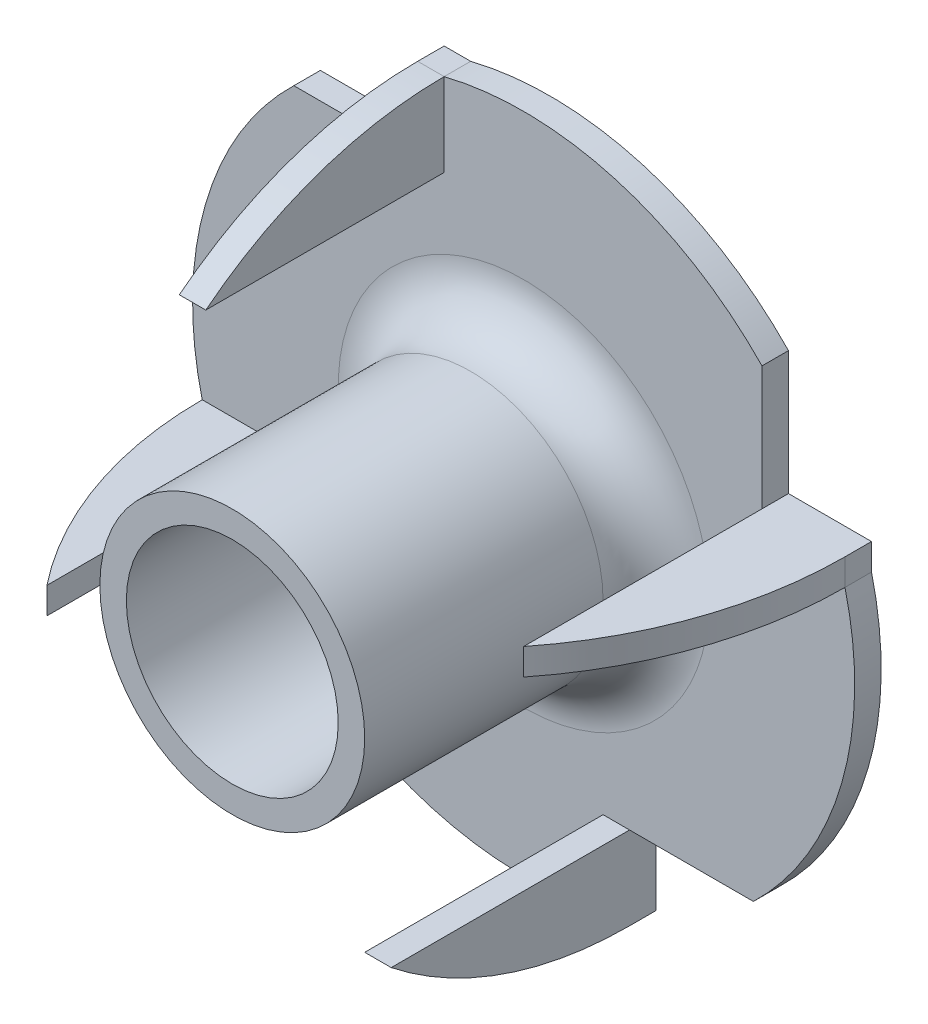
ISO-10303-21;
HEADER;
FILE_DESCRIPTION(('STEP AP214'),'2;1');
FILE_NAME('part.step','',(''),(''),'','','');
FILE_SCHEMA(('AUTOMOTIVE_DESIGN { 1 0 10303 214 1 1 1 1 }'));
ENDSEC;
DATA;
#1=APPLICATION_CONTEXT('core data for automotive mechanical design processes');
#2=APPLICATION_PROTOCOL_DEFINITION('international standard','automotive_design',2000,#1);
#3=PRODUCT_CONTEXT('',#1,'mechanical');
#4=PRODUCT('Part','Part','',(#3));
#5=PRODUCT_RELATED_PRODUCT_CATEGORY('part','',(#4));
#6=PRODUCT_DEFINITION_FORMATION('','',#4);
#7=PRODUCT_DEFINITION_CONTEXT('part definition',#1,'design');
#8=PRODUCT_DEFINITION('design','',#6,#7);
#9=PRODUCT_DEFINITION_SHAPE('','',#8);
#10=(LENGTH_UNIT() NAMED_UNIT(*) SI_UNIT(.MILLI.,.METRE.));
#11=(NAMED_UNIT(*) PLANE_ANGLE_UNIT() SI_UNIT($,.RADIAN.));
#12=(NAMED_UNIT(*) SI_UNIT($,.STERADIAN.) SOLID_ANGLE_UNIT());
#13=UNCERTAINTY_MEASURE_WITH_UNIT(LENGTH_MEASURE(1.E-05),#10,'distance_accuracy_value','');
#14=(GEOMETRIC_REPRESENTATION_CONTEXT(3) GLOBAL_UNCERTAINTY_ASSIGNED_CONTEXT((#13)) GLOBAL_UNIT_ASSIGNED_CONTEXT((#10,
#11,#12)) REPRESENTATION_CONTEXT('',''));
#15=CARTESIAN_POINT('',(0.,0.,0.));
#16=DIRECTION('',(0.,0.,1.));
#17=DIRECTION('',(1.,0.,0.));
#18=AXIS2_PLACEMENT_3D('',#15,#16,#17);
#19=CARTESIAN_POINT('',(8.67467578644865,-9.00000000000009,-1.001));
#20=DIRECTION('',(0.,1.,0.));
#21=DIRECTION('',(-1.,0.,0.));
#22=AXIS2_PLACEMENT_3D('',#19,#20,#21);
#23=PLANE('',#22);
#24=DIRECTION('',(0.,0.,1.));
#25=VECTOR('',#24,1.);
#26=CARTESIAN_POINT('',(3.99999999999991,-9.00000000000004,-1.));
#27=LINE('',#26,#25);
#28=CARTESIAN_POINT('',(3.99999999999989,-9.00000000000004,-1.));
#29=VERTEX_POINT('',#28);
#30=CARTESIAN_POINT('',(3.99999999999989,-9.00000000000004,0.));
#31=VERTEX_POINT('',#30);
#32=EDGE_CURVE('E75',#29,#31,#27,.T.);
#33=ORIENTED_EDGE('',*,*,#32,.F.);
#34=DIRECTION('',(1.,0.,0.));
#35=VECTOR('',#34,1.);
#36=CARTESIAN_POINT('',(8.67467578644865,-9.00000000000009,-1.));
#37=LINE('',#36,#35);
#38=CARTESIAN_POINT('',(8.67467578644865,-9.00000000000009,-1.));
#39=VERTEX_POINT('',#38);
#40=EDGE_CURVE('E339',#29,#39,#37,.T.);
#41=ORIENTED_EDGE('',*,*,#40,.T.);
#42=DIRECTION('',(0.,0.,1.));
#43=VECTOR('',#42,1.);
#44=CARTESIAN_POINT('',(8.67467578644865,-9.00000000000009,14.9921573509274));
#45=LINE('',#44,#43);
#46=CARTESIAN_POINT('',(8.67467578644865,-9.00000000000009,0.));
#47=VERTEX_POINT('',#46);
#48=EDGE_CURVE('E218',#47,#39,#45,.F.);
#49=ORIENTED_EDGE('',*,*,#48,.F.);
#50=DIRECTION('',(-1.,0.,0.));
#51=VECTOR('',#50,1.);
#52=CARTESIAN_POINT('',(8.67467578644865,-9.00000000000009,0.));
#53=LINE('',#52,#51);
#54=EDGE_CURVE('E359',#47,#31,#53,.T.);
#55=ORIENTED_EDGE('',*,*,#54,.T.);
#56=EDGE_LOOP('',(#33,#41,#49,#55));
#57=FACE_BOUND('',#56,.T.);
#58=ADVANCED_FACE('F50',(#57),#23,.F.);
#59=CARTESIAN_POINT('',(9.,8.67467578644874,-1.001));
#60=DIRECTION('',(-1.,0.,0.));
#61=DIRECTION('',(0.,-1.,0.));
#62=AXIS2_PLACEMENT_3D('',#59,#60,#61);
#63=PLANE('',#62);
#64=DIRECTION('',(0.,0.,1.));
#65=VECTOR('',#64,1.);
#66=CARTESIAN_POINT('',(9.,4.,-1.));
#67=LINE('',#66,#65);
#68=CARTESIAN_POINT('',(9.,4.,-1.));
#69=VERTEX_POINT('',#68);
#70=CARTESIAN_POINT('',(9.,4.,0.));
#71=VERTEX_POINT('',#70);
#72=EDGE_CURVE('E253',#69,#71,#67,.T.);
#73=ORIENTED_EDGE('',*,*,#72,.F.);
#74=DIRECTION('',(0.,1.,0.));
#75=VECTOR('',#74,1.);
#76=CARTESIAN_POINT('',(9.,8.67467578644874,-1.));
#77=LINE('',#76,#75);
#78=CARTESIAN_POINT('',(9.,8.67467578644874,-1.));
#79=VERTEX_POINT('',#78);
#80=EDGE_CURVE('E312',#69,#79,#77,.T.);
#81=ORIENTED_EDGE('',*,*,#80,.T.);
#82=DIRECTION('',(0.,0.,1.));
#83=VECTOR('',#82,1.);
#84=CARTESIAN_POINT('',(9.,8.67467578644874,14.9921573509274));
#85=LINE('',#84,#83);
#86=CARTESIAN_POINT('',(9.,8.67467578644874,0.));
#87=VERTEX_POINT('',#86);
#88=EDGE_CURVE('E332',#87,#79,#85,.F.);
#89=ORIENTED_EDGE('',*,*,#88,.F.);
#90=DIRECTION('',(0.,-1.,0.));
#91=VECTOR('',#90,1.);
#92=CARTESIAN_POINT('',(9.,8.67467578644874,0.));
#93=LINE('',#92,#91);
#94=EDGE_CURVE('E342',#87,#71,#93,.T.);
#95=ORIENTED_EDGE('',*,*,#94,.T.);
#96=EDGE_LOOP('',(#73,#81,#89,#95));
#97=FACE_BOUND('',#96,.T.);
#98=ADVANCED_FACE('F555',(#97),#63,.F.);
#99=CARTESIAN_POINT('',(-8.67467578644871,9.00000000000003,-1.001));
#100=DIRECTION('',(0.,-1.,0.));
#101=DIRECTION('',(1.,0.,0.));
#102=AXIS2_PLACEMENT_3D('',#99,#100,#101);
#103=PLANE('',#102);
#104=DIRECTION('',(0.,0.,1.));
#105=VECTOR('',#104,1.);
#106=CARTESIAN_POINT('',(-3.99999999999997,9.00000000000001,-1.));
#107=LINE('',#106,#105);
#108=CARTESIAN_POINT('',(-3.99999999999996,9.00000000000001,-1.));
#109=VERTEX_POINT('',#108);
#110=CARTESIAN_POINT('',(-3.99999999999996,9.00000000000001,0.));
#111=VERTEX_POINT('',#110);
#112=EDGE_CURVE('E63',#109,#111,#107,.T.);
#113=ORIENTED_EDGE('',*,*,#112,.F.);
#114=DIRECTION('',(-1.,0.,0.));
#115=VECTOR('',#114,1.);
#116=CARTESIAN_POINT('',(-8.67467578644871,9.00000000000003,-1.));
#117=LINE('',#116,#115);
#118=CARTESIAN_POINT('',(-8.67467578644871,9.00000000000003,-1.));
#119=VERTEX_POINT('',#118);
#120=EDGE_CURVE('E330',#109,#119,#117,.T.);
#121=ORIENTED_EDGE('',*,*,#120,.T.);
#122=DIRECTION('',(0.,0.,1.));
#123=VECTOR('',#122,1.);
#124=CARTESIAN_POINT('',(-8.67467578644871,9.00000000000003,14.9921573509274));
#125=LINE('',#124,#123);
#126=CARTESIAN_POINT('',(-8.67467578644871,9.00000000000003,0.));
#127=VERTEX_POINT('',#126);
#128=EDGE_CURVE('E309',#127,#119,#125,.F.);
#129=ORIENTED_EDGE('',*,*,#128,.F.);
#130=DIRECTION('',(1.,0.,0.));
#131=VECTOR('',#130,1.);
#132=CARTESIAN_POINT('',(-8.67467578644871,9.00000000000003,0.));
#133=LINE('',#132,#131);
#134=EDGE_CURVE('E319',#127,#111,#133,.T.);
#135=ORIENTED_EDGE('',*,*,#134,.T.);
#136=EDGE_LOOP('',(#113,#121,#129,#135));
#137=FACE_BOUND('',#136,.T.);
#138=ADVANCED_FACE('F560',(#137),#103,.F.);
#139=CARTESIAN_POINT('',(0.,7.,-1.));
#140=DIRECTION('',(0.,0.,1.));
#141=DIRECTION('',(1.,0.,0.));
#142=AXIS2_PLACEMENT_3D('',#139,#140,#141);
#143=PLANE('',#142);
#144=ORIENTED_EDGE('',*,*,#80,.F.);
#145=DIRECTION('',(-1.,0.,0.));
#146=VECTOR('',#145,1.);
#147=CARTESIAN_POINT('',(9.,4.,-1.));
#148=LINE('',#147,#146);
#149=CARTESIAN_POINT('',(12.1346610995116,4.,-1.));
#150=VERTEX_POINT('',#149);
#151=EDGE_CURVE('E242',#150,#69,#148,.T.);
#152=ORIENTED_EDGE('',*,*,#151,.F.);
#153=DIRECTION('',(0.,-1.,0.));
#154=VECTOR('',#153,1.);
#155=CARTESIAN_POINT('',(12.1346610995116,4.,-1.));
#156=LINE('',#155,#154);
#157=CARTESIAN_POINT('',(12.1346610995116,3.,-1.));
#158=VERTEX_POINT('',#157);
#159=EDGE_CURVE('E261',#150,#158,#156,.T.);
#160=ORIENTED_EDGE('',*,*,#159,.T.);
#161=CARTESIAN_POINT('',(0.,0.,-1.));
#162=DIRECTION('',(0.,0.,1.));
#163=DIRECTION('',(1.,0.,0.));
#164=AXIS2_PLACEMENT_3D('',#161,#162,#163);
#165=CIRCLE('',#164,12.5);
#166=EDGE_CURVE('E57',#39,#158,#165,.T.);
#167=ORIENTED_EDGE('',*,*,#166,.F.);
#168=ORIENTED_EDGE('',*,*,#40,.F.);
#169=DIRECTION('',(0.,1.,0.));
#170=VECTOR('',#169,1.);
#171=CARTESIAN_POINT('',(3.99999999999991,-9.00000000000004,-1.));
#172=LINE('',#171,#170);
#173=CARTESIAN_POINT('',(3.99999999999987,-12.1346610995116,-1.));
#174=VERTEX_POINT('',#173);
#175=EDGE_CURVE('E276',#174,#29,#172,.T.);
#176=ORIENTED_EDGE('',*,*,#175,.F.);
#177=DIRECTION('',(-1.,0.,0.));
#178=VECTOR('',#177,1.);
#179=CARTESIAN_POINT('',(3.99999999999987,-12.1346610995116,-1.));
#180=LINE('',#179,#178);
#181=CARTESIAN_POINT('',(2.99999999999987,-12.1346610995116,-1.));
#182=VERTEX_POINT('',#181);
#183=EDGE_CURVE('E291',#174,#182,#180,.T.);
#184=ORIENTED_EDGE('',*,*,#183,.T.);
#185=CARTESIAN_POINT('',(-9.,-8.67467578644874,-1.));
#186=VERTEX_POINT('',#185);
#187=EDGE_CURVE('E11',#186,#182,#165,.T.);
#188=ORIENTED_EDGE('',*,*,#187,.F.);
#189=DIRECTION('',(0.,-1.,0.));
#190=VECTOR('',#189,1.);
#191=CARTESIAN_POINT('',(-9.,-8.67467578644874,-1.));
#192=LINE('',#191,#190);
#193=CARTESIAN_POINT('',(-9.,-4.,-1.));
#194=VERTEX_POINT('',#193);
#195=EDGE_CURVE('E416',#194,#186,#192,.T.);
#196=ORIENTED_EDGE('',*,*,#195,.F.);
#197=DIRECTION('',(1.,0.,0.));
#198=VECTOR('',#197,1.);
#199=CARTESIAN_POINT('',(-9.,-4.,-1.));
#200=LINE('',#199,#198);
#201=CARTESIAN_POINT('',(-12.1346610995116,-4.,-1.));
#202=VERTEX_POINT('',#201);
#203=EDGE_CURVE('E366',#202,#194,#200,.T.);
#204=ORIENTED_EDGE('',*,*,#203,.F.);
#205=DIRECTION('',(0.,1.,0.));
#206=VECTOR('',#205,1.);
#207=CARTESIAN_POINT('',(-12.1346610995116,-4.,-1.));
#208=LINE('',#207,#206);
#209=CARTESIAN_POINT('',(-12.1346610995116,-3.,-1.));
#210=VERTEX_POINT('',#209);
#211=EDGE_CURVE('E383',#202,#210,#208,.T.);
#212=ORIENTED_EDGE('',*,*,#211,.T.);
#213=EDGE_CURVE('E60',#119,#210,#165,.T.);
#214=ORIENTED_EDGE('',*,*,#213,.F.);
#215=ORIENTED_EDGE('',*,*,#120,.F.);
#216=DIRECTION('',(0.,-1.,0.));
#217=VECTOR('',#216,1.);
#218=CARTESIAN_POINT('',(-3.99999999999997,9.00000000000001,-1.));
#219=LINE('',#218,#217);
#220=CARTESIAN_POINT('',(-3.99999999999996,12.1346610995116,-1.));
#221=VERTEX_POINT('',#220);
#222=EDGE_CURVE('E208',#221,#109,#219,.T.);
#223=ORIENTED_EDGE('',*,*,#222,.F.);
#224=DIRECTION('',(1.,0.,0.));
#225=VECTOR('',#224,1.);
#226=CARTESIAN_POINT('',(-3.99999999999996,12.1346610995116,-1.));
#227=LINE('',#226,#225);
#228=CARTESIAN_POINT('',(-2.99999999999996,12.1346610995116,-1.));
#229=VERTEX_POINT('',#228);
#230=EDGE_CURVE('E227',#221,#229,#227,.T.);
#231=ORIENTED_EDGE('',*,*,#230,.T.);
#232=EDGE_CURVE('E453',#79,#229,#165,.T.);
#233=ORIENTED_EDGE('',*,*,#232,.F.);
#234=EDGE_LOOP('',(#144,#152,#160,#167,#168,#176,#184,#188,#196,#204,#212,#214,#215,#223,#231,#233));
#235=FACE_BOUND('',#234,.T.);
#236=CARTESIAN_POINT('',(0.,0.,-1.));
#237=DIRECTION('',(0.,0.,1.));
#238=DIRECTION('',(1.,0.,0.));
#239=AXIS2_PLACEMENT_3D('',#236,#237,#238);
#240=CIRCLE('',#239,7.);
#241=CARTESIAN_POINT('',(7.,0.,-1.));
#242=VERTEX_POINT('',#241);
#243=EDGE_CURVE('E423',#242,#242,#240,.T.);
#244=ORIENTED_EDGE('',*,*,#243,.T.);
#245=EDGE_LOOP('',(#244));
#246=FACE_BOUND('',#245,.T.);
#247=ADVANCED_FACE('F47',(#235,#246),#143,.F.);
#248=CARTESIAN_POINT('',(0.,0.,14.9921573509274));
#249=DIRECTION('',(0.,0.,1.));
#250=DIRECTION('',(1.,0.,0.));
#251=AXIS2_PLACEMENT_3D('',#248,#249,#250);
#252=CYLINDRICAL_SURFACE('',#251,12.5);
#253=ORIENTED_EDGE('',*,*,#232,.T.);
#254=DIRECTION('',(0.,0.,1.));
#255=VECTOR('',#254,1.);
#256=CARTESIAN_POINT('',(-2.99999999999996,12.1346610995116,14.9921573509274));
#257=LINE('',#256,#255);
#258=CARTESIAN_POINT('',(-2.99999999999996,12.1346610995116,0.));
#259=VERTEX_POINT('',#258);
#260=EDGE_CURVE('E314',#229,#259,#257,.T.);
#261=ORIENTED_EDGE('',*,*,#260,.T.);
#262=CARTESIAN_POINT('',(0.,0.,0.));
#263=DIRECTION('',(0.,0.,1.));
#264=DIRECTION('',(1.,0.,0.));
#265=AXIS2_PLACEMENT_3D('',#262,#263,#264);
#266=CIRCLE('',#265,12.5);
#267=EDGE_CURVE('E454',#87,#259,#266,.T.);
#268=ORIENTED_EDGE('',*,*,#267,.F.);
#269=ORIENTED_EDGE('',*,*,#88,.T.);
#270=EDGE_LOOP('',(#253,#261,#268,#269));
#271=FACE_BOUND('',#270,.T.);
#272=ADVANCED_FACE('F462',(#271),#252,.T.);
#273=CARTESIAN_POINT('',(-12.1346610995116,-3.,0.));
#274=VERTEX_POINT('',#273);
#275=EDGE_CURVE('E441',#127,#274,#266,.T.);
#276=ORIENTED_EDGE('',*,*,#275,.F.);
#277=ORIENTED_EDGE('',*,*,#128,.T.);
#278=ORIENTED_EDGE('',*,*,#213,.T.);
#279=DIRECTION('',(0.,0.,1.));
#280=VECTOR('',#279,1.);
#281=CARTESIAN_POINT('',(-12.1346610995116,-3.,14.9921573509274));
#282=LINE('',#281,#280);
#283=EDGE_CURVE('E403',#210,#274,#282,.T.);
#284=ORIENTED_EDGE('',*,*,#283,.T.);
#285=EDGE_LOOP('',(#276,#277,#278,#284));
#286=FACE_BOUND('',#285,.T.);
#287=ADVANCED_FACE('F596',(#286),#252,.T.);
#288=ORIENTED_EDGE('',*,*,#166,.T.);
#289=DIRECTION('',(0.,0.,1.));
#290=VECTOR('',#289,1.);
#291=CARTESIAN_POINT('',(12.1346610995116,3.,14.9921573509274));
#292=LINE('',#291,#290);
#293=CARTESIAN_POINT('',(12.1346610995116,3.,0.));
#294=VERTEX_POINT('',#293);
#295=EDGE_CURVE('E333',#158,#294,#292,.T.);
#296=ORIENTED_EDGE('',*,*,#295,.T.);
#297=EDGE_CURVE('E446',#47,#294,#266,.T.);
#298=ORIENTED_EDGE('',*,*,#297,.F.);
#299=ORIENTED_EDGE('',*,*,#48,.T.);
#300=EDGE_LOOP('',(#288,#296,#298,#299));
#301=FACE_BOUND('',#300,.T.);
#302=ADVANCED_FACE('F505',(#301),#252,.T.);
#303=ORIENTED_EDGE('',*,*,#187,.T.);
#304=DIRECTION('',(0.,0.,1.));
#305=VECTOR('',#304,1.);
#306=CARTESIAN_POINT('',(2.99999999999987,-12.1346610995116,14.9921573509274));
#307=LINE('',#306,#305);
#308=CARTESIAN_POINT('',(2.99999999999987,-12.1346610995116,0.));
#309=VERTEX_POINT('',#308);
#310=EDGE_CURVE('E353',#182,#309,#307,.T.);
#311=ORIENTED_EDGE('',*,*,#310,.T.);
#312=CARTESIAN_POINT('',(-9.,-8.67467578644874,0.));
#313=VERTEX_POINT('',#312);
#314=EDGE_CURVE('E443',#313,#309,#266,.T.);
#315=ORIENTED_EDGE('',*,*,#314,.F.);
#316=DIRECTION('',(0.,0.,1.));
#317=VECTOR('',#316,1.);
#318=CARTESIAN_POINT('',(-9.,-8.67467578644874,14.9921573509274));
#319=LINE('',#318,#317);
#320=EDGE_CURVE('E402',#313,#186,#319,.F.);
#321=ORIENTED_EDGE('',*,*,#320,.T.);
#322=EDGE_LOOP('',(#303,#311,#315,#321));
#323=FACE_BOUND('',#322,.T.);
#324=ADVANCED_FACE('F536',(#323),#252,.T.);
#325=CARTESIAN_POINT('',(-9.,-8.67467578644874,-1.001));
#326=DIRECTION('',(1.,0.,0.));
#327=DIRECTION('',(0.,1.,0.));
#328=AXIS2_PLACEMENT_3D('',#325,#326,#327);
#329=PLANE('',#328);
#330=DIRECTION('',(0.,0.,1.));
#331=VECTOR('',#330,1.);
#332=CARTESIAN_POINT('',(-9.,-4.,-1.));
#333=LINE('',#332,#331);
#334=CARTESIAN_POINT('',(-9.,-4.,0.));
#335=VERTEX_POINT('',#334);
#336=EDGE_CURVE('E372',#194,#335,#333,.T.);
#337=ORIENTED_EDGE('',*,*,#336,.F.);
#338=ORIENTED_EDGE('',*,*,#195,.T.);
#339=ORIENTED_EDGE('',*,*,#320,.F.);
#340=DIRECTION('',(0.,1.,0.));
#341=VECTOR('',#340,1.);
#342=CARTESIAN_POINT('',(-9.,-8.67467578644874,0.));
#343=LINE('',#342,#341);
#344=EDGE_CURVE('E407',#313,#335,#343,.T.);
#345=ORIENTED_EDGE('',*,*,#344,.T.);
#346=EDGE_LOOP('',(#337,#338,#339,#345));
#347=FACE_BOUND('',#346,.T.);
#348=ADVANCED_FACE('F534',(#347),#329,.F.);
#349=CARTESIAN_POINT('',(0.,7.,0.));
#350=DIRECTION('',(0.,0.,1.));
#351=DIRECTION('',(1.,0.,0.));
#352=AXIS2_PLACEMENT_3D('',#349,#350,#351);
#353=PLANE('',#352);
#354=ORIENTED_EDGE('',*,*,#134,.F.);
#355=ORIENTED_EDGE('',*,*,#275,.T.);
#356=DIRECTION('',(-1.,0.,0.));
#357=VECTOR('',#356,1.);
#358=CARTESIAN_POINT('',(-9.,-3.,0.));
#359=LINE('',#358,#357);
#360=CARTESIAN_POINT('',(-9.,-3.,0.));
#361=VERTEX_POINT('',#360);
#362=EDGE_CURVE('E414',#361,#274,#359,.T.);
#363=ORIENTED_EDGE('',*,*,#362,.F.);
#364=EDGE_CURVE('E408',#335,#361,#343,.T.);
#365=ORIENTED_EDGE('',*,*,#364,.F.);
#366=ORIENTED_EDGE('',*,*,#344,.F.);
#367=ORIENTED_EDGE('',*,*,#314,.T.);
#368=DIRECTION('',(0.,-1.,0.));
#369=VECTOR('',#368,1.);
#370=CARTESIAN_POINT('',(2.99999999999991,-9.00000000000003,0.));
#371=LINE('',#370,#369);
#372=CARTESIAN_POINT('',(2.99999999999991,-9.00000000000003,0.));
#373=VERTEX_POINT('',#372);
#374=EDGE_CURVE('E362',#373,#309,#371,.T.);
#375=ORIENTED_EDGE('',*,*,#374,.F.);
#376=EDGE_CURVE('E358',#31,#373,#53,.T.);
#377=ORIENTED_EDGE('',*,*,#376,.F.);
#378=ORIENTED_EDGE('',*,*,#54,.F.);
#379=ORIENTED_EDGE('',*,*,#297,.T.);
#380=DIRECTION('',(1.,0.,0.));
#381=VECTOR('',#380,1.);
#382=CARTESIAN_POINT('',(9.,3.,0.));
#383=LINE('',#382,#381);
#384=CARTESIAN_POINT('',(9.,3.,0.));
#385=VERTEX_POINT('',#384);
#386=EDGE_CURVE('E341',#385,#294,#383,.T.);
#387=ORIENTED_EDGE('',*,*,#386,.F.);
#388=EDGE_CURVE('E337',#71,#385,#93,.T.);
#389=ORIENTED_EDGE('',*,*,#388,.F.);
#390=ORIENTED_EDGE('',*,*,#94,.F.);
#391=ORIENTED_EDGE('',*,*,#267,.T.);
#392=DIRECTION('',(0.,1.,0.));
#393=VECTOR('',#392,1.);
#394=CARTESIAN_POINT('',(-2.99999999999997,9.00000000000001,0.));
#395=LINE('',#394,#393);
#396=CARTESIAN_POINT('',(-2.99999999999997,9.00000000000001,0.));
#397=VERTEX_POINT('',#396);
#398=EDGE_CURVE('E323',#397,#259,#395,.T.);
#399=ORIENTED_EDGE('',*,*,#398,.F.);
#400=EDGE_CURVE('E317',#111,#397,#133,.T.);
#401=ORIENTED_EDGE('',*,*,#400,.F.);
#402=EDGE_LOOP('',(#354,#355,#363,#365,#366,#367,#375,#377,#378,#379,#387,#389,#390,#391,#399,#401));
#403=FACE_BOUND('',#402,.T.);
#404=CARTESIAN_POINT('',(0.,0.,0.));
#405=DIRECTION('',(0.,0.,1.));
#406=DIRECTION('',(1.,0.,0.));
#407=AXIS2_PLACEMENT_3D('',#404,#405,#406);
#408=CIRCLE('',#407,7.);
#409=CARTESIAN_POINT('',(7.,0.,0.));
#410=VERTEX_POINT('',#409);
#411=EDGE_CURVE('E442',#410,#410,#408,.T.);
#412=ORIENTED_EDGE('',*,*,#411,.F.);
#413=EDGE_LOOP('',(#412));
#414=FACE_BOUND('',#413,.T.);
#415=ADVANCED_FACE('F464',(#403,#414),#353,.T.);
#416=CARTESIAN_POINT('',(0.,0.,2.));
#417=DIRECTION('',(0.,0.,1.));
#418=DIRECTION('',(1.,0.,0.));
#419=AXIS2_PLACEMENT_3D('',#416,#417,#418);
#420=TOROIDAL_SURFACE('',#419,7.,2.);
#421=ORIENTED_EDGE('',*,*,#411,.T.);
#422=EDGE_LOOP('',(#421));
#423=FACE_BOUND('',#422,.T.);
#424=CARTESIAN_POINT('',(0.,0.,2.));
#425=DIRECTION('',(0.,0.,1.));
#426=DIRECTION('',(1.,0.,0.));
#427=AXIS2_PLACEMENT_3D('',#424,#425,#426);
#428=CIRCLE('',#427,5.);
#429=CARTESIAN_POINT('',(5.,0.,2.));
#430=VERTEX_POINT('',#429);
#431=EDGE_CURVE('E440',#430,#430,#428,.T.);
#432=ORIENTED_EDGE('',*,*,#431,.F.);
#433=EDGE_LOOP('',(#432));
#434=FACE_BOUND('',#433,.T.);
#435=ADVANCED_FACE('F589',(#423,#434),#420,.F.);
#436=CARTESIAN_POINT('',(0.,0.,14.9921573509274));
#437=DIRECTION('',(0.,0.,1.));
#438=DIRECTION('',(1.,0.,0.));
#439=AXIS2_PLACEMENT_3D('',#436,#437,#438);
#440=CYLINDRICAL_SURFACE('',#439,5.);
#441=ORIENTED_EDGE('',*,*,#431,.T.);
#442=EDGE_LOOP('',(#441));
#443=FACE_BOUND('',#442,.T.);
#444=CARTESIAN_POINT('',(0.,0.,11.));
#445=DIRECTION('',(0.,0.,1.));
#446=DIRECTION('',(1.,0.,0.));
#447=AXIS2_PLACEMENT_3D('',#444,#445,#446);
#448=CIRCLE('',#447,5.);
#449=CARTESIAN_POINT('',(5.,0.,11.));
#450=VERTEX_POINT('',#449);
#451=EDGE_CURVE('E433',#450,#450,#448,.T.);
#452=ORIENTED_EDGE('',*,*,#451,.F.);
#453=EDGE_LOOP('',(#452));
#454=FACE_BOUND('',#453,.T.);
#455=ADVANCED_FACE('F584',(#443,#454),#440,.T.);
#456=CARTESIAN_POINT('',(0.,4.,11.));
#457=DIRECTION('',(0.,0.,1.));
#458=DIRECTION('',(1.,0.,0.));
#459=AXIS2_PLACEMENT_3D('',#456,#457,#458);
#460=PLANE('',#459);
#461=ORIENTED_EDGE('',*,*,#451,.T.);
#462=EDGE_LOOP('',(#461));
#463=FACE_BOUND('',#462,.T.);
#464=CARTESIAN_POINT('',(0.,0.,11.));
#465=DIRECTION('',(0.,0.,1.));
#466=DIRECTION('',(1.,0.,0.));
#467=AXIS2_PLACEMENT_3D('',#464,#465,#466);
#468=CIRCLE('',#467,4.);
#469=CARTESIAN_POINT('',(4.,0.,11.));
#470=VERTEX_POINT('',#469);
#471=EDGE_CURVE('E427',#470,#470,#468,.T.);
#472=ORIENTED_EDGE('',*,*,#471,.F.);
#473=EDGE_LOOP('',(#472));
#474=FACE_BOUND('',#473,.T.);
#475=ADVANCED_FACE('F583',(#463,#474),#460,.T.);
#476=CARTESIAN_POINT('',(0.,0.,14.9921573509274));
#477=DIRECTION('',(0.,0.,1.));
#478=DIRECTION('',(1.,0.,0.));
#479=AXIS2_PLACEMENT_3D('',#476,#477,#478);
#480=CYLINDRICAL_SURFACE('',#479,4.);
#481=CARTESIAN_POINT('',(0.,0.,2.));
#482=DIRECTION('',(0.,0.,1.));
#483=DIRECTION('',(1.,0.,0.));
#484=AXIS2_PLACEMENT_3D('',#481,#482,#483);
#485=CIRCLE('',#484,4.);
#486=CARTESIAN_POINT('',(4.,0.,2.));
#487=VERTEX_POINT('',#486);
#488=EDGE_CURVE('E422',#487,#487,#485,.T.);
#489=ORIENTED_EDGE('',*,*,#488,.F.);
#490=EDGE_LOOP('',(#489));
#491=FACE_BOUND('',#490,.T.);
#492=ORIENTED_EDGE('',*,*,#471,.T.);
#493=EDGE_LOOP('',(#492));
#494=FACE_BOUND('',#493,.T.);
#495=ADVANCED_FACE('F580',(#491,#494),#480,.F.);
#496=CARTESIAN_POINT('',(0.,0.,2.));
#497=DIRECTION('',(0.,0.,1.));
#498=DIRECTION('',(1.,0.,0.));
#499=AXIS2_PLACEMENT_3D('',#496,#497,#498);
#500=TOROIDAL_SURFACE('',#499,7.,3.);
#501=ORIENTED_EDGE('',*,*,#243,.F.);
#502=EDGE_LOOP('',(#501));
#503=FACE_BOUND('',#502,.T.);
#504=ORIENTED_EDGE('',*,*,#488,.T.);
#505=EDGE_LOOP('',(#504));
#506=FACE_BOUND('',#505,.T.);
#507=ADVANCED_FACE('F571',(#503,#506),#500,.T.);
#508=CARTESIAN_POINT('',(-9.,-4.,-1.));
#509=DIRECTION('',(-1.,0.,0.));
#510=DIRECTION('',(0.,0.,1.));
#511=AXIS2_PLACEMENT_3D('',#508,#509,#510);
#512=PLANE('',#511);
#513=ORIENTED_EDGE('',*,*,#364,.T.);
#514=DIRECTION('',(0.,0.,1.));
#515=VECTOR('',#514,1.);
#516=CARTESIAN_POINT('',(-9.,-3.,-1.));
#517=LINE('',#516,#515);
#518=CARTESIAN_POINT('',(-9.,-3.,9.));
#519=VERTEX_POINT('',#518);
#520=EDGE_CURVE('E329',#361,#519,#517,.T.);
#521=ORIENTED_EDGE('',*,*,#520,.T.);
#522=DIRECTION('',(0.,1.,0.));
#523=VECTOR('',#522,1.);
#524=CARTESIAN_POINT('',(-9.,-4.,9.));
#525=LINE('',#524,#523);
#526=CARTESIAN_POINT('',(-9.,-4.,9.));
#527=VERTEX_POINT('',#526);
#528=EDGE_CURVE('E400',#527,#519,#525,.T.);
#529=ORIENTED_EDGE('',*,*,#528,.F.);
#530=EDGE_CURVE('E375',#335,#527,#333,.T.);
#531=ORIENTED_EDGE('',*,*,#530,.F.);
#532=EDGE_LOOP('',(#513,#521,#529,#531));
#533=FACE_BOUND('',#532,.T.);
#534=ADVANCED_FACE('F513',(#533),#512,.F.);
#535=CARTESIAN_POINT('',(2.35272642428525,-4.,0.));
#536=DIRECTION('',(0.,1.,0.));
#537=DIRECTION('',(0.,0.,1.));
#538=AXIS2_PLACEMENT_3D('',#535,#536,#537);
#539=CYLINDRICAL_SURFACE('',#538,14.4873875237968);
#540=CARTESIAN_POINT('',(2.35272642428525,-3.,0.));
#541=DIRECTION('',(0.,-1.,0.));
#542=DIRECTION('',(0.,0.,1.));
#543=AXIS2_PLACEMENT_3D('',#540,#541,#542);
#544=CIRCLE('',#543,14.4873875237968);
#545=EDGE_CURVE('E373',#519,#274,#544,.T.);
#546=ORIENTED_EDGE('',*,*,#545,.T.);
#547=DIRECTION('',(0.,1.,0.));
#548=VECTOR('',#547,1.);
#549=CARTESIAN_POINT('',(-12.1346610995116,-4.,0.));
#550=LINE('',#549,#548);
#551=CARTESIAN_POINT('',(-12.1346610995116,-4.,0.));
#552=VERTEX_POINT('',#551);
#553=EDGE_CURVE('E395',#552,#274,#550,.T.);
#554=ORIENTED_EDGE('',*,*,#553,.F.);
#555=CARTESIAN_POINT('',(2.35272642428525,-4.,0.));
#556=DIRECTION('',(0.,-1.,0.));
#557=DIRECTION('',(0.,0.,1.));
#558=AXIS2_PLACEMENT_3D('',#555,#556,#557);
#559=CIRCLE('',#558,14.4873875237968);
#560=EDGE_CURVE('E378',#527,#552,#559,.T.);
#561=ORIENTED_EDGE('',*,*,#560,.F.);
#562=ORIENTED_EDGE('',*,*,#528,.T.);
#563=EDGE_LOOP('',(#546,#554,#561,#562));
#564=FACE_BOUND('',#563,.T.);
#565=ADVANCED_FACE('F525',(#564),#539,.T.);
#566=CARTESIAN_POINT('',(-12.1346610995116,-4.,-1.));
#567=DIRECTION('',(1.,0.,0.));
#568=DIRECTION('',(0.,0.,-1.));
#569=AXIS2_PLACEMENT_3D('',#566,#567,#568);
#570=PLANE('',#569);
#571=ORIENTED_EDGE('',*,*,#283,.F.);
#572=ORIENTED_EDGE('',*,*,#211,.F.);
#573=DIRECTION('',(0.,0.,-1.));
#574=VECTOR('',#573,1.);
#575=CARTESIAN_POINT('',(-12.1346610995116,-4.,-1.));
#576=LINE('',#575,#574);
#577=EDGE_CURVE('E381',#552,#202,#576,.T.);
#578=ORIENTED_EDGE('',*,*,#577,.F.);
#579=ORIENTED_EDGE('',*,*,#553,.T.);
#580=EDGE_LOOP('',(#571,#572,#578,#579));
#581=FACE_BOUND('',#580,.T.);
#582=ADVANCED_FACE('F527',(#581),#570,.F.);
#583=CARTESIAN_POINT('',(2.35272642428525,-4.,0.));
#584=DIRECTION('',(0.,1.,0.));
#585=DIRECTION('',(0.,0.,1.));
#586=AXIS2_PLACEMENT_3D('',#583,#584,#585);
#587=PLANE('',#586);
#588=ORIENTED_EDGE('',*,*,#203,.T.);
#589=ORIENTED_EDGE('',*,*,#336,.T.);
#590=ORIENTED_EDGE('',*,*,#530,.T.);
#591=ORIENTED_EDGE('',*,*,#560,.T.);
#592=ORIENTED_EDGE('',*,*,#577,.T.);
#593=EDGE_LOOP('',(#588,#589,#590,#591,#592));
#594=FACE_BOUND('',#593,.T.);
#595=ADVANCED_FACE('F533',(#594),#587,.F.);
#596=CARTESIAN_POINT('',(2.35272642428525,-3.,0.));
#597=DIRECTION('',(0.,1.,0.));
#598=DIRECTION('',(0.,0.,1.));
#599=AXIS2_PLACEMENT_3D('',#596,#597,#598);
#600=PLANE('',#599);
#601=ORIENTED_EDGE('',*,*,#520,.F.);
#602=ORIENTED_EDGE('',*,*,#362,.T.);
#603=ORIENTED_EDGE('',*,*,#545,.F.);
#604=EDGE_LOOP('',(#601,#602,#603));
#605=FACE_BOUND('',#604,.T.);
#606=ADVANCED_FACE('F518',(#605),#600,.T.);
#607=CARTESIAN_POINT('',(3.99999999999991,-9.00000000000004,-1.));
#608=DIRECTION('',(0.,-1.,0.));
#609=DIRECTION('',(1.,0.,0.));
#610=AXIS2_PLACEMENT_3D('',#607,#608,#609);
#611=PLANE('',#610);
#612=ORIENTED_EDGE('',*,*,#376,.T.);
#613=DIRECTION('',(0.,0.,1.));
#614=VECTOR('',#613,1.);
#615=CARTESIAN_POINT('',(2.99999999999991,-9.00000000000003,-1.));
#616=LINE('',#615,#614);
#617=CARTESIAN_POINT('',(2.99999999999991,-9.00000000000003,9.));
#618=VERTEX_POINT('',#617);
#619=EDGE_CURVE('E294',#373,#618,#616,.T.);
#620=ORIENTED_EDGE('',*,*,#619,.T.);
#621=DIRECTION('',(-1.,0.,0.));
#622=VECTOR('',#621,1.);
#623=CARTESIAN_POINT('',(3.99999999999991,-9.00000000000004,9.));
#624=LINE('',#623,#622);
#625=CARTESIAN_POINT('',(3.99999999999991,-9.00000000000004,9.));
#626=VERTEX_POINT('',#625);
#627=EDGE_CURVE('E264',#626,#618,#624,.T.);
#628=ORIENTED_EDGE('',*,*,#627,.F.);
#629=EDGE_CURVE('E285',#31,#626,#27,.T.);
#630=ORIENTED_EDGE('',*,*,#629,.F.);
#631=EDGE_LOOP('',(#612,#620,#628,#630));
#632=FACE_BOUND('',#631,.T.);
#633=ADVANCED_FACE('F484',(#632),#611,.F.);
#634=CARTESIAN_POINT('',(4.00000000000002,2.35272642428521,0.));
#635=DIRECTION('',(-1.,0.,0.));
#636=DIRECTION('',(0.,-1.,0.));
#637=AXIS2_PLACEMENT_3D('',#634,#635,#636);
#638=CYLINDRICAL_SURFACE('',#637,14.4873875237968);
#639=CARTESIAN_POINT('',(3.00000000000002,2.35272642428522,0.));
#640=DIRECTION('',(1.,0.,0.));
#641=DIRECTION('',(0.,0.,1.));
#642=AXIS2_PLACEMENT_3D('',#639,#640,#641);
#643=CIRCLE('',#642,14.4873875237968);
#644=EDGE_CURVE('E283',#618,#309,#643,.T.);
#645=ORIENTED_EDGE('',*,*,#644,.T.);
#646=DIRECTION('',(-1.,0.,0.));
#647=VECTOR('',#646,1.);
#648=CARTESIAN_POINT('',(3.99999999999987,-12.1346610995116,0.));
#649=LINE('',#648,#647);
#650=CARTESIAN_POINT('',(3.99999999999987,-12.1346610995116,0.));
#651=VERTEX_POINT('',#650);
#652=EDGE_CURVE('E303',#651,#309,#649,.T.);
#653=ORIENTED_EDGE('',*,*,#652,.F.);
#654=CARTESIAN_POINT('',(4.00000000000002,2.35272642428521,0.));
#655=DIRECTION('',(1.,0.,0.));
#656=DIRECTION('',(0.,0.,1.));
#657=AXIS2_PLACEMENT_3D('',#654,#655,#656);
#658=CIRCLE('',#657,14.4873875237968);
#659=EDGE_CURVE('E290',#626,#651,#658,.T.);
#660=ORIENTED_EDGE('',*,*,#659,.F.);
#661=ORIENTED_EDGE('',*,*,#627,.T.);
#662=EDGE_LOOP('',(#645,#653,#660,#661));
#663=FACE_BOUND('',#662,.T.);
#664=ADVANCED_FACE('F487',(#663),#638,.T.);
#665=CARTESIAN_POINT('',(3.99999999999987,-12.1346610995116,-1.));
#666=DIRECTION('',(0.,1.,0.));
#667=DIRECTION('',(-1.,0.,0.));
#668=AXIS2_PLACEMENT_3D('',#665,#666,#667);
#669=PLANE('',#668);
#670=ORIENTED_EDGE('',*,*,#310,.F.);
#671=ORIENTED_EDGE('',*,*,#183,.F.);
#672=DIRECTION('',(0.,0.,-1.));
#673=VECTOR('',#672,1.);
#674=CARTESIAN_POINT('',(3.99999999999987,-12.1346610995116,-1.));
#675=LINE('',#674,#673);
#676=EDGE_CURVE('E286',#651,#174,#675,.T.);
#677=ORIENTED_EDGE('',*,*,#676,.F.);
#678=ORIENTED_EDGE('',*,*,#652,.T.);
#679=EDGE_LOOP('',(#670,#671,#677,#678));
#680=FACE_BOUND('',#679,.T.);
#681=ADVANCED_FACE('F493',(#680),#669,.F.);
#682=CARTESIAN_POINT('',(4.00000000000002,2.35272642428521,0.));
#683=DIRECTION('',(-1.,0.,0.));
#684=DIRECTION('',(0.,0.,1.));
#685=AXIS2_PLACEMENT_3D('',#682,#683,#684);
#686=PLANE('',#685);
#687=ORIENTED_EDGE('',*,*,#175,.T.);
#688=ORIENTED_EDGE('',*,*,#32,.T.);
#689=ORIENTED_EDGE('',*,*,#629,.T.);
#690=ORIENTED_EDGE('',*,*,#659,.T.);
#691=ORIENTED_EDGE('',*,*,#676,.T.);
#692=EDGE_LOOP('',(#687,#688,#689,#690,#691));
#693=FACE_BOUND('',#692,.T.);
#694=ADVANCED_FACE('F477',(#693),#686,.F.);
#695=CARTESIAN_POINT('',(3.00000000000002,2.35272642428522,0.));
#696=DIRECTION('',(-1.,0.,0.));
#697=DIRECTION('',(0.,0.,1.));
#698=AXIS2_PLACEMENT_3D('',#695,#696,#697);
#699=PLANE('',#698);
#700=ORIENTED_EDGE('',*,*,#619,.F.);
#701=ORIENTED_EDGE('',*,*,#374,.T.);
#702=ORIENTED_EDGE('',*,*,#644,.F.);
#703=EDGE_LOOP('',(#700,#701,#702));
#704=FACE_BOUND('',#703,.T.);
#705=ADVANCED_FACE('F538',(#704),#699,.T.);
#706=CARTESIAN_POINT('',(9.,4.,-1.));
#707=DIRECTION('',(1.,0.,0.));
#708=DIRECTION('',(0.,0.,-1.));
#709=AXIS2_PLACEMENT_3D('',#706,#707,#708);
#710=PLANE('',#709);
#711=ORIENTED_EDGE('',*,*,#388,.T.);
#712=DIRECTION('',(0.,0.,1.));
#713=VECTOR('',#712,1.);
#714=CARTESIAN_POINT('',(9.,3.,-1.));
#715=LINE('',#714,#713);
#716=CARTESIAN_POINT('',(9.,3.,9.));
#717=VERTEX_POINT('',#716);
#718=EDGE_CURVE('E265',#385,#717,#715,.T.);
#719=ORIENTED_EDGE('',*,*,#718,.T.);
#720=DIRECTION('',(0.,-1.,0.));
#721=VECTOR('',#720,1.);
#722=CARTESIAN_POINT('',(9.,4.,9.));
#723=LINE('',#722,#721);
#724=CARTESIAN_POINT('',(9.,4.,9.));
#725=VERTEX_POINT('',#724);
#726=EDGE_CURVE('E240',#725,#717,#723,.T.);
#727=ORIENTED_EDGE('',*,*,#726,.F.);
#728=EDGE_CURVE('E249',#71,#725,#67,.T.);
#729=ORIENTED_EDGE('',*,*,#728,.F.);
#730=EDGE_LOOP('',(#711,#719,#727,#729));
#731=FACE_BOUND('',#730,.T.);
#732=ADVANCED_FACE('F539',(#731),#710,.F.);
#733=CARTESIAN_POINT('',(-2.35272642428525,4.,0.));
#734=DIRECTION('',(0.,-1.,0.));
#735=DIRECTION('',(0.,0.,-1.));
#736=AXIS2_PLACEMENT_3D('',#733,#734,#735);
#737=CYLINDRICAL_SURFACE('',#736,14.4873875237968);
#738=CARTESIAN_POINT('',(-2.35272642428525,3.,0.));
#739=DIRECTION('',(0.,1.,0.));
#740=DIRECTION('',(0.,0.,1.));
#741=AXIS2_PLACEMENT_3D('',#738,#739,#740);
#742=CIRCLE('',#741,14.4873875237968);
#743=EDGE_CURVE('E246',#717,#294,#742,.T.);
#744=ORIENTED_EDGE('',*,*,#743,.T.);
#745=DIRECTION('',(0.,-1.,0.));
#746=VECTOR('',#745,1.);
#747=CARTESIAN_POINT('',(12.1346610995116,4.,0.));
#748=LINE('',#747,#746);
#749=CARTESIAN_POINT('',(12.1346610995116,4.,0.));
#750=VERTEX_POINT('',#749);
#751=EDGE_CURVE('E275',#750,#294,#748,.T.);
#752=ORIENTED_EDGE('',*,*,#751,.F.);
#753=CARTESIAN_POINT('',(-2.35272642428525,4.,0.));
#754=DIRECTION('',(0.,1.,0.));
#755=DIRECTION('',(0.,0.,1.));
#756=AXIS2_PLACEMENT_3D('',#753,#754,#755);
#757=CIRCLE('',#756,14.4873875237968);
#758=EDGE_CURVE('E254',#725,#750,#757,.T.);
#759=ORIENTED_EDGE('',*,*,#758,.F.);
#760=ORIENTED_EDGE('',*,*,#726,.T.);
#761=EDGE_LOOP('',(#744,#752,#759,#760));
#762=FACE_BOUND('',#761,.T.);
#763=ADVANCED_FACE('F546',(#762),#737,.T.);
#764=CARTESIAN_POINT('',(12.1346610995116,4.,-1.));
#765=DIRECTION('',(-1.,0.,0.));
#766=DIRECTION('',(0.,0.,1.));
#767=AXIS2_PLACEMENT_3D('',#764,#765,#766);
#768=PLANE('',#767);
#769=ORIENTED_EDGE('',*,*,#295,.F.);
#770=ORIENTED_EDGE('',*,*,#159,.F.);
#771=DIRECTION('',(0.,0.,-1.));
#772=VECTOR('',#771,1.);
#773=CARTESIAN_POINT('',(12.1346610995116,4.,-1.));
#774=LINE('',#773,#772);
#775=EDGE_CURVE('E256',#750,#150,#774,.T.);
#776=ORIENTED_EDGE('',*,*,#775,.F.);
#777=ORIENTED_EDGE('',*,*,#751,.T.);
#778=EDGE_LOOP('',(#769,#770,#776,#777));
#779=FACE_BOUND('',#778,.T.);
#780=ADVANCED_FACE('F701',(#779),#768,.F.);
#781=CARTESIAN_POINT('',(-2.35272642428525,4.,0.));
#782=DIRECTION('',(0.,-1.,0.));
#783=DIRECTION('',(0.,0.,1.));
#784=AXIS2_PLACEMENT_3D('',#781,#782,#783);
#785=PLANE('',#784);
#786=ORIENTED_EDGE('',*,*,#151,.T.);
#787=ORIENTED_EDGE('',*,*,#72,.T.);
#788=ORIENTED_EDGE('',*,*,#728,.T.);
#789=ORIENTED_EDGE('',*,*,#758,.T.);
#790=ORIENTED_EDGE('',*,*,#775,.T.);
#791=EDGE_LOOP('',(#786,#787,#788,#789,#790));
#792=FACE_BOUND('',#791,.T.);
#793=ADVANCED_FACE('F711',(#792),#785,.F.);
#794=CARTESIAN_POINT('',(-2.35272642428525,3.,0.));
#795=DIRECTION('',(0.,-1.,0.));
#796=DIRECTION('',(0.,0.,1.));
#797=AXIS2_PLACEMENT_3D('',#794,#795,#796);
#798=PLANE('',#797);
#799=ORIENTED_EDGE('',*,*,#718,.F.);
#800=ORIENTED_EDGE('',*,*,#386,.T.);
#801=ORIENTED_EDGE('',*,*,#743,.F.);
#802=EDGE_LOOP('',(#799,#800,#801));
#803=FACE_BOUND('',#802,.T.);
#804=ADVANCED_FACE('F724',(#803),#798,.T.);
#805=CARTESIAN_POINT('',(-3.99999999999997,9.00000000000001,-1.));
#806=DIRECTION('',(0.,1.,0.));
#807=DIRECTION('',(-1.,0.,0.));
#808=AXIS2_PLACEMENT_3D('',#805,#806,#807);
#809=PLANE('',#808);
#810=ORIENTED_EDGE('',*,*,#400,.T.);
#811=DIRECTION('',(0.,0.,1.));
#812=VECTOR('',#811,1.);
#813=CARTESIAN_POINT('',(-2.99999999999997,9.00000000000001,-1.));
#814=LINE('',#813,#812);
#815=CARTESIAN_POINT('',(-2.99999999999997,9.00000000000001,9.));
#816=VERTEX_POINT('',#815);
#817=EDGE_CURVE('E212',#397,#816,#814,.T.);
#818=ORIENTED_EDGE('',*,*,#817,.T.);
#819=DIRECTION('',(1.,0.,0.));
#820=VECTOR('',#819,1.);
#821=CARTESIAN_POINT('',(-3.99999999999997,9.00000000000001,9.));
#822=LINE('',#821,#820);
#823=CARTESIAN_POINT('',(-3.99999999999997,9.00000000000001,9.));
#824=VERTEX_POINT('',#823);
#825=EDGE_CURVE('E211',#824,#816,#822,.T.);
#826=ORIENTED_EDGE('',*,*,#825,.F.);
#827=EDGE_CURVE('E196',#111,#824,#107,.T.);
#828=ORIENTED_EDGE('',*,*,#827,.F.);
#829=EDGE_LOOP('',(#810,#818,#826,#828));
#830=FACE_BOUND('',#829,.T.);
#831=ADVANCED_FACE('F215',(#830),#809,.F.);
#832=CARTESIAN_POINT('',(-4.00000000000001,-2.35272642428523,0.));
#833=DIRECTION('',(1.,0.,0.));
#834=DIRECTION('',(0.,1.,0.));
#835=AXIS2_PLACEMENT_3D('',#832,#833,#834);
#836=CYLINDRICAL_SURFACE('',#835,14.4873875237968);
#837=CARTESIAN_POINT('',(-3.00000000000001,-2.35272642428524,0.));
#838=DIRECTION('',(-1.,0.,0.));
#839=DIRECTION('',(0.,0.,1.));
#840=AXIS2_PLACEMENT_3D('',#837,#838,#839);
#841=CIRCLE('',#840,14.4873875237968);
#842=EDGE_CURVE('E237',#816,#259,#841,.T.);
#843=ORIENTED_EDGE('',*,*,#842,.T.);
#844=DIRECTION('',(1.,0.,0.));
#845=VECTOR('',#844,1.);
#846=CARTESIAN_POINT('',(-3.99999999999996,12.1346610995116,0.));
#847=LINE('',#846,#845);
#848=CARTESIAN_POINT('',(-3.99999999999996,12.1346610995116,0.));
#849=VERTEX_POINT('',#848);
#850=EDGE_CURVE('E219',#849,#259,#847,.T.);
#851=ORIENTED_EDGE('',*,*,#850,.F.);
#852=CARTESIAN_POINT('',(-4.00000000000001,-2.35272642428523,0.));
#853=DIRECTION('',(-1.,0.,0.));
#854=DIRECTION('',(0.,0.,1.));
#855=AXIS2_PLACEMENT_3D('',#852,#853,#854);
#856=CIRCLE('',#855,14.4873875237968);
#857=EDGE_CURVE('E201',#824,#849,#856,.T.);
#858=ORIENTED_EDGE('',*,*,#857,.F.);
#859=ORIENTED_EDGE('',*,*,#825,.T.);
#860=EDGE_LOOP('',(#843,#851,#858,#859));
#861=FACE_BOUND('',#860,.T.);
#862=ADVANCED_FACE('F225',(#861),#836,.T.);
#863=CARTESIAN_POINT('',(-3.99999999999996,12.1346610995116,-1.));
#864=DIRECTION('',(0.,-1.,0.));
#865=DIRECTION('',(1.,0.,0.));
#866=AXIS2_PLACEMENT_3D('',#863,#864,#865);
#867=PLANE('',#866);
#868=ORIENTED_EDGE('',*,*,#260,.F.);
#869=ORIENTED_EDGE('',*,*,#230,.F.);
#870=DIRECTION('',(0.,0.,-1.));
#871=VECTOR('',#870,1.);
#872=CARTESIAN_POINT('',(-3.99999999999996,12.1346610995116,-1.));
#873=LINE('',#872,#871);
#874=EDGE_CURVE('E229',#849,#221,#873,.T.);
#875=ORIENTED_EDGE('',*,*,#874,.F.);
#876=ORIENTED_EDGE('',*,*,#850,.T.);
#877=EDGE_LOOP('',(#868,#869,#875,#876));
#878=FACE_BOUND('',#877,.T.);
#879=ADVANCED_FACE('F473',(#878),#867,.F.);
#880=CARTESIAN_POINT('',(-4.00000000000001,-2.35272642428523,0.));
#881=DIRECTION('',(1.,0.,0.));
#882=DIRECTION('',(0.,0.,1.));
#883=AXIS2_PLACEMENT_3D('',#880,#881,#882);
#884=PLANE('',#883);
#885=ORIENTED_EDGE('',*,*,#222,.T.);
#886=ORIENTED_EDGE('',*,*,#112,.T.);
#887=ORIENTED_EDGE('',*,*,#827,.T.);
#888=ORIENTED_EDGE('',*,*,#857,.T.);
#889=ORIENTED_EDGE('',*,*,#874,.T.);
#890=EDGE_LOOP('',(#885,#886,#887,#888,#889));
#891=FACE_BOUND('',#890,.T.);
#892=ADVANCED_FACE('F203',(#891),#884,.F.);
#893=CARTESIAN_POINT('',(-3.00000000000001,-2.35272642428524,0.));
#894=DIRECTION('',(1.,0.,0.));
#895=DIRECTION('',(0.,0.,1.));
#896=AXIS2_PLACEMENT_3D('',#893,#894,#895);
#897=PLANE('',#896);
#898=ORIENTED_EDGE('',*,*,#817,.F.);
#899=ORIENTED_EDGE('',*,*,#398,.T.);
#900=ORIENTED_EDGE('',*,*,#842,.F.);
#901=EDGE_LOOP('',(#898,#899,#900));
#902=FACE_BOUND('',#901,.T.);
#903=ADVANCED_FACE('F466',(#902),#897,.T.);
#904=CLOSED_SHELL('',(#58,#98,#138,#247,#272,#287,#302,#324,#348,#415,#435,#455,#475,#495,#507,
#534,#565,#582,#595,#606,#633,#664,#681,#694,#705,#732,#763,#780,#793,#804,#831,#862,#879,#892,#903));
#905=MANIFOLD_SOLID_BREP('B2',#904);
#906=ADVANCED_BREP_SHAPE_REPRESENTATION('',(#18,#905),#14);
#907=SHAPE_DEFINITION_REPRESENTATION(#9,#906);
ENDSEC;
END-ISO-10303-21;
